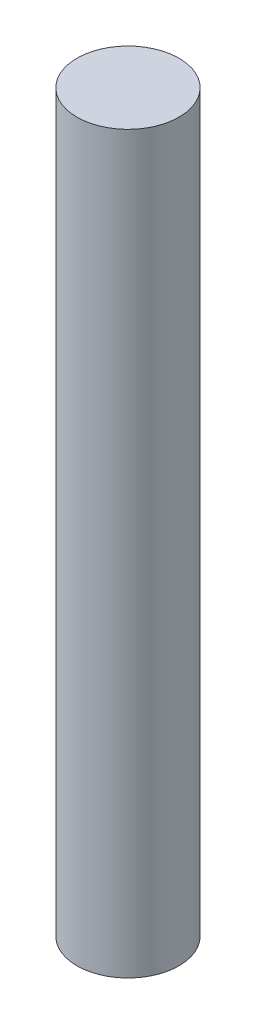
ISO-10303-21;
HEADER;
FILE_DESCRIPTION(('STEP AP214'),'2;1');
FILE_NAME('part.step','',(''),(''),'','','');
FILE_SCHEMA(('AUTOMOTIVE_DESIGN { 1 0 10303 214 1 1 1 1 }'));
ENDSEC;
DATA;
#1=APPLICATION_CONTEXT('core data for automotive mechanical design processes');
#2=APPLICATION_PROTOCOL_DEFINITION('international standard','automotive_design',2000,#1);
#3=PRODUCT_CONTEXT('',#1,'mechanical');
#4=PRODUCT('Part','Part','',(#3));
#5=PRODUCT_RELATED_PRODUCT_CATEGORY('part','',(#4));
#6=PRODUCT_DEFINITION_FORMATION('','',#4);
#7=PRODUCT_DEFINITION_CONTEXT('part definition',#1,'design');
#8=PRODUCT_DEFINITION('design','',#6,#7);
#9=PRODUCT_DEFINITION_SHAPE('','',#8);
#10=(LENGTH_UNIT() NAMED_UNIT(*) SI_UNIT(.MILLI.,.METRE.));
#11=(NAMED_UNIT(*) PLANE_ANGLE_UNIT() SI_UNIT($,.RADIAN.));
#12=(NAMED_UNIT(*) SI_UNIT($,.STERADIAN.) SOLID_ANGLE_UNIT());
#13=UNCERTAINTY_MEASURE_WITH_UNIT(LENGTH_MEASURE(1.E-05),#10,'distance_accuracy_value','');
#14=(GEOMETRIC_REPRESENTATION_CONTEXT(3) GLOBAL_UNCERTAINTY_ASSIGNED_CONTEXT((#13)) GLOBAL_UNIT_ASSIGNED_CONTEXT((#10,
#11,#12)) REPRESENTATION_CONTEXT('',''));
#15=CARTESIAN_POINT('',(0.,0.,0.));
#16=DIRECTION('',(0.,0.,1.));
#17=DIRECTION('',(1.,0.,0.));
#18=AXIS2_PLACEMENT_3D('',#15,#16,#17);
#19=CARTESIAN_POINT('',(0.,22.86,0.));
#20=DIRECTION('',(0.,-1.,0.));
#21=DIRECTION('',(0.,0.,-1.));
#22=AXIS2_PLACEMENT_3D('',#19,#20,#21);
#23=CYLINDRICAL_SURFACE('',#22,1.5875);
#24=CARTESIAN_POINT('',(0.,22.86,0.));
#25=DIRECTION('',(0.,1.,0.));
#26=DIRECTION('',(0.,0.,1.));
#27=AXIS2_PLACEMENT_3D('',#24,#25,#26);
#28=CIRCLE('',#27,1.5875);
#29=CARTESIAN_POINT('',(0.,22.86,1.5875));
#30=VERTEX_POINT('',#29);
#31=EDGE_CURVE('E10',#30,#30,#28,.T.);
#32=ORIENTED_EDGE('',*,*,#31,.F.);
#33=EDGE_LOOP('',(#32));
#34=FACE_BOUND('',#33,.T.);
#35=CARTESIAN_POINT('',(0.,0.,0.));
#36=DIRECTION('',(0.,1.,0.));
#37=DIRECTION('',(0.,0.,1.));
#38=AXIS2_PLACEMENT_3D('',#35,#36,#37);
#39=CIRCLE('',#38,1.5875);
#40=CARTESIAN_POINT('',(0.,0.,1.5875));
#41=VERTEX_POINT('',#40);
#42=EDGE_CURVE('E38',#41,#41,#39,.T.);
#43=ORIENTED_EDGE('',*,*,#42,.T.);
#44=EDGE_LOOP('',(#43));
#45=FACE_BOUND('',#44,.T.);
#46=ADVANCED_FACE('F35',(#34,#45),#23,.T.);
#47=CARTESIAN_POINT('',(0.,22.86,0.));
#48=DIRECTION('',(0.,1.,0.));
#49=DIRECTION('',(0.,0.,1.));
#50=AXIS2_PLACEMENT_3D('',#47,#48,#49);
#51=PLANE('',#50);
#52=ORIENTED_EDGE('',*,*,#31,.T.);
#53=EDGE_LOOP('',(#52));
#54=FACE_BOUND('',#53,.T.);
#55=ADVANCED_FACE('F50',(#54),#51,.T.);
#56=CARTESIAN_POINT('',(0.,0.,0.));
#57=DIRECTION('',(0.,1.,0.));
#58=DIRECTION('',(0.,0.,1.));
#59=AXIS2_PLACEMENT_3D('',#56,#57,#58);
#60=PLANE('',#59);
#61=ORIENTED_EDGE('',*,*,#42,.F.);
#62=EDGE_LOOP('',(#61));
#63=FACE_BOUND('',#62,.T.);
#64=ADVANCED_FACE('F48',(#63),#60,.F.);
#65=CLOSED_SHELL('',(#46,#55,#64));
#66=MANIFOLD_SOLID_BREP('B2',#65);
#67=ADVANCED_BREP_SHAPE_REPRESENTATION('',(#18,#66),#14);
#68=SHAPE_DEFINITION_REPRESENTATION(#9,#67);
ENDSEC;
END-ISO-10303-21;
